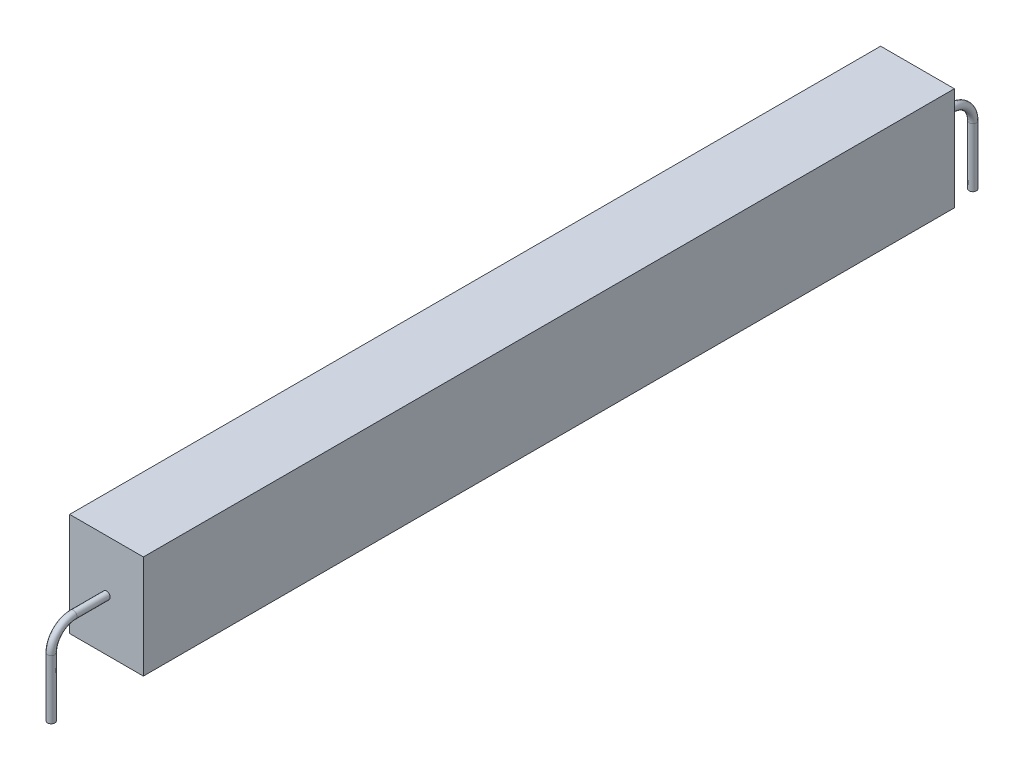
ISO-10303-21;
HEADER;
FILE_DESCRIPTION(('STEP AP214'),'2;1');
FILE_NAME('part.step','',(''),(''),'','','');
FILE_SCHEMA(('AUTOMOTIVE_DESIGN { 1 0 10303 214 1 1 1 1 }'));
ENDSEC;
DATA;
#1=APPLICATION_CONTEXT('core data for automotive mechanical design processes');
#2=APPLICATION_PROTOCOL_DEFINITION('international standard','automotive_design',2000,#1);
#3=PRODUCT_CONTEXT('',#1,'mechanical');
#4=PRODUCT('Part','Part','',(#3));
#5=PRODUCT_RELATED_PRODUCT_CATEGORY('part','',(#4));
#6=PRODUCT_DEFINITION_FORMATION('','',#4);
#7=PRODUCT_DEFINITION_CONTEXT('part definition',#1,'design');
#8=PRODUCT_DEFINITION('design','',#6,#7);
#9=PRODUCT_DEFINITION_SHAPE('','',#8);
#10=(LENGTH_UNIT() NAMED_UNIT(*) SI_UNIT(.MILLI.,.METRE.));
#11=(NAMED_UNIT(*) PLANE_ANGLE_UNIT() SI_UNIT($,.RADIAN.));
#12=(NAMED_UNIT(*) SI_UNIT($,.STERADIAN.) SOLID_ANGLE_UNIT());
#13=UNCERTAINTY_MEASURE_WITH_UNIT(LENGTH_MEASURE(1.E-05),#10,'distance_accuracy_value','');
#14=(GEOMETRIC_REPRESENTATION_CONTEXT(3) GLOBAL_UNCERTAINTY_ASSIGNED_CONTEXT((#13)) GLOBAL_UNIT_ASSIGNED_CONTEXT((#10,
#11,#12)) REPRESENTATION_CONTEXT('',''));
#15=CARTESIAN_POINT('',(0.,0.,0.));
#16=DIRECTION('',(0.,0.,1.));
#17=DIRECTION('',(1.,0.,0.));
#18=AXIS2_PLACEMENT_3D('',#15,#16,#17);
#19=CARTESIAN_POINT('',(4.99999999999999,14.,-55.));
#20=DIRECTION('',(1.,0.,0.));
#21=DIRECTION('',(0.,0.,-1.));
#22=AXIS2_PLACEMENT_3D('',#19,#20,#21);
#23=PLANE('',#22);
#24=DIRECTION('',(0.,1.,0.));
#25=VECTOR('',#24,1.);
#26=CARTESIAN_POINT('',(4.99999999999999,14.,55.));
#27=LINE('',#26,#25);
#28=CARTESIAN_POINT('',(4.99999999999999,0.,55.));
#29=VERTEX_POINT('',#28);
#30=CARTESIAN_POINT('',(4.99999999999999,14.,55.));
#31=VERTEX_POINT('',#30);
#32=EDGE_CURVE('E102',#29,#31,#27,.T.);
#33=ORIENTED_EDGE('',*,*,#32,.F.);
#34=DIRECTION('',(0.,0.,1.));
#35=VECTOR('',#34,1.);
#36=CARTESIAN_POINT('',(4.99999999999999,0.,-55.));
#37=LINE('',#36,#35);
#38=CARTESIAN_POINT('',(4.99999999999999,0.,-55.));
#39=VERTEX_POINT('',#38);
#40=EDGE_CURVE('E44',#39,#29,#37,.T.);
#41=ORIENTED_EDGE('',*,*,#40,.F.);
#42=DIRECTION('',(0.,1.,0.));
#43=VECTOR('',#42,1.);
#44=CARTESIAN_POINT('',(4.99999999999999,14.,-55.));
#45=LINE('',#44,#43);
#46=CARTESIAN_POINT('',(4.99999999999999,14.,-55.));
#47=VERTEX_POINT('',#46);
#48=EDGE_CURVE('E95',#39,#47,#45,.T.);
#49=ORIENTED_EDGE('',*,*,#48,.T.);
#50=DIRECTION('',(0.,0.,1.));
#51=VECTOR('',#50,1.);
#52=CARTESIAN_POINT('',(4.99999999999999,14.,-55.));
#53=LINE('',#52,#51);
#54=EDGE_CURVE('E38',#47,#31,#53,.T.);
#55=ORIENTED_EDGE('',*,*,#54,.T.);
#56=EDGE_LOOP('',(#33,#41,#49,#55));
#57=FACE_BOUND('',#56,.T.);
#58=ADVANCED_FACE('F35',(#57),#23,.T.);
#59=CARTESIAN_POINT('',(-5.,0.,-55.));
#60=DIRECTION('',(0.,-1.,0.));
#61=DIRECTION('',(0.,0.,-1.));
#62=AXIS2_PLACEMENT_3D('',#59,#60,#61);
#63=PLANE('',#62);
#64=DIRECTION('',(1.,0.,0.));
#65=VECTOR('',#64,1.);
#66=CARTESIAN_POINT('',(-5.,0.,55.));
#67=LINE('',#66,#65);
#68=CARTESIAN_POINT('',(-5.,0.,55.));
#69=VERTEX_POINT('',#68);
#70=EDGE_CURVE('E97',#69,#29,#67,.T.);
#71=ORIENTED_EDGE('',*,*,#70,.F.);
#72=DIRECTION('',(0.,0.,1.));
#73=VECTOR('',#72,1.);
#74=CARTESIAN_POINT('',(-5.,0.,-55.));
#75=LINE('',#74,#73);
#76=CARTESIAN_POINT('',(-5.,0.,-55.));
#77=VERTEX_POINT('',#76);
#78=EDGE_CURVE('E69',#77,#69,#75,.T.);
#79=ORIENTED_EDGE('',*,*,#78,.F.);
#80=DIRECTION('',(1.,0.,0.));
#81=VECTOR('',#80,1.);
#82=CARTESIAN_POINT('',(-5.,0.,-55.));
#83=LINE('',#82,#81);
#84=EDGE_CURVE('E92',#77,#39,#83,.T.);
#85=ORIENTED_EDGE('',*,*,#84,.T.);
#86=ORIENTED_EDGE('',*,*,#40,.T.);
#87=EDGE_LOOP('',(#71,#79,#85,#86));
#88=FACE_BOUND('',#87,.T.);
#89=ADVANCED_FACE('F114',(#88),#63,.T.);
#90=CARTESIAN_POINT('',(-5.,14.,-55.));
#91=DIRECTION('',(-1.,0.,0.));
#92=DIRECTION('',(0.,0.,1.));
#93=AXIS2_PLACEMENT_3D('',#90,#91,#92);
#94=PLANE('',#93);
#95=DIRECTION('',(0.,-1.,0.));
#96=VECTOR('',#95,1.);
#97=CARTESIAN_POINT('',(-5.,14.,55.));
#98=LINE('',#97,#96);
#99=CARTESIAN_POINT('',(-5.,14.,55.));
#100=VERTEX_POINT('',#99);
#101=EDGE_CURVE('E87',#100,#69,#98,.T.);
#102=ORIENTED_EDGE('',*,*,#101,.F.);
#103=DIRECTION('',(0.,0.,1.));
#104=VECTOR('',#103,1.);
#105=CARTESIAN_POINT('',(-5.,14.,-55.));
#106=LINE('',#105,#104);
#107=CARTESIAN_POINT('',(-5.,14.,-55.));
#108=VERTEX_POINT('',#107);
#109=EDGE_CURVE('E82',#108,#100,#106,.T.);
#110=ORIENTED_EDGE('',*,*,#109,.F.);
#111=DIRECTION('',(0.,-1.,0.));
#112=VECTOR('',#111,1.);
#113=CARTESIAN_POINT('',(-5.,14.,-55.));
#114=LINE('',#113,#112);
#115=EDGE_CURVE('E85',#108,#77,#114,.T.);
#116=ORIENTED_EDGE('',*,*,#115,.T.);
#117=ORIENTED_EDGE('',*,*,#78,.T.);
#118=EDGE_LOOP('',(#102,#110,#116,#117));
#119=FACE_BOUND('',#118,.T.);
#120=ADVANCED_FACE('F84',(#119),#94,.T.);
#121=CARTESIAN_POINT('',(-5.,14.,-55.));
#122=DIRECTION('',(0.,1.,0.));
#123=DIRECTION('',(0.,0.,1.));
#124=AXIS2_PLACEMENT_3D('',#121,#122,#123);
#125=PLANE('',#124);
#126=DIRECTION('',(-1.,0.,0.));
#127=VECTOR('',#126,1.);
#128=CARTESIAN_POINT('',(-5.,14.,55.));
#129=LINE('',#128,#127);
#130=EDGE_CURVE('E105',#31,#100,#129,.T.);
#131=ORIENTED_EDGE('',*,*,#130,.F.);
#132=ORIENTED_EDGE('',*,*,#54,.F.);
#133=DIRECTION('',(-1.,0.,0.));
#134=VECTOR('',#133,1.);
#135=CARTESIAN_POINT('',(-5.,14.,-55.));
#136=LINE('',#135,#134);
#137=EDGE_CURVE('E91',#47,#108,#136,.T.);
#138=ORIENTED_EDGE('',*,*,#137,.T.);
#139=ORIENTED_EDGE('',*,*,#109,.T.);
#140=EDGE_LOOP('',(#131,#132,#138,#139));
#141=FACE_BOUND('',#140,.T.);
#142=ADVANCED_FACE('F94',(#141),#125,.T.);
#143=CARTESIAN_POINT('',(0.,0.,-55.));
#144=DIRECTION('',(0.,0.,1.));
#145=DIRECTION('',(1.,0.,0.));
#146=AXIS2_PLACEMENT_3D('',#143,#144,#145);
#147=PLANE('',#146);
#148=CARTESIAN_POINT('',(0.,7.,-55.));
#149=DIRECTION('',(0.,0.,1.));
#150=DIRECTION('',(1.,0.,0.));
#151=AXIS2_PLACEMENT_3D('',#148,#149,#150);
#152=CIRCLE('',#151,0.5);
#153=CARTESIAN_POINT('',(0.5,7.,-55.));
#154=VERTEX_POINT('',#153);
#155=EDGE_CURVE('E189',#154,#154,#152,.T.);
#156=ORIENTED_EDGE('',*,*,#155,.T.);
#157=EDGE_LOOP('',(#156));
#158=FACE_BOUND('',#157,.T.);
#159=ORIENTED_EDGE('',*,*,#48,.F.);
#160=ORIENTED_EDGE('',*,*,#84,.F.);
#161=ORIENTED_EDGE('',*,*,#115,.F.);
#162=ORIENTED_EDGE('',*,*,#137,.F.);
#163=EDGE_LOOP('',(#159,#160,#161,#162));
#164=FACE_BOUND('',#163,.T.);
#165=ADVANCED_FACE('F90',(#158,#164),#147,.F.);
#166=CARTESIAN_POINT('',(0.,0.,55.));
#167=DIRECTION('',(0.,0.,1.));
#168=DIRECTION('',(1.,0.,0.));
#169=AXIS2_PLACEMENT_3D('',#166,#167,#168);
#170=PLANE('',#169);
#171=CARTESIAN_POINT('',(0.,7.,55.));
#172=DIRECTION('',(0.,0.,1.));
#173=DIRECTION('',(1.,0.,0.));
#174=AXIS2_PLACEMENT_3D('',#171,#172,#173);
#175=CIRCLE('',#174,0.5);
#176=CARTESIAN_POINT('',(0.5,7.,55.));
#177=VERTEX_POINT('',#176);
#178=EDGE_CURVE('E11',#177,#177,#175,.T.);
#179=ORIENTED_EDGE('',*,*,#178,.F.);
#180=EDGE_LOOP('',(#179));
#181=FACE_BOUND('',#180,.T.);
#182=ORIENTED_EDGE('',*,*,#32,.T.);
#183=ORIENTED_EDGE('',*,*,#130,.T.);
#184=ORIENTED_EDGE('',*,*,#101,.T.);
#185=ORIENTED_EDGE('',*,*,#70,.T.);
#186=EDGE_LOOP('',(#182,#183,#184,#185));
#187=FACE_BOUND('',#186,.T.);
#188=ADVANCED_FACE('F113',(#181,#187),#170,.T.);
#189=CARTESIAN_POINT('',(0.,4.,62.5));
#190=DIRECTION('',(0.,-1.,0.));
#191=DIRECTION('',(0.,0.,-1.));
#192=AXIS2_PLACEMENT_3D('',#189,#190,#191);
#193=CYLINDRICAL_SURFACE('',#192,0.5);
#194=CARTESIAN_POINT('',(0.,4.,62.5));
#195=DIRECTION('',(0.,-1.,0.));
#196=DIRECTION('',(1.,0.,0.));
#197=AXIS2_PLACEMENT_3D('',#194,#195,#196);
#198=CIRCLE('',#197,0.5);
#199=CARTESIAN_POINT('',(0.,4.,63.));
#200=VERTEX_POINT('',#199);
#201=EDGE_CURVE('E176',#200,#200,#198,.T.);
#202=ORIENTED_EDGE('',*,*,#201,.T.);
#203=EDGE_LOOP('',(#202));
#204=FACE_BOUND('',#203,.T.);
#205=CARTESIAN_POINT('',(0.,-4.,62.5));
#206=DIRECTION('',(0.,-1.,0.));
#207=DIRECTION('',(1.,0.,0.));
#208=AXIS2_PLACEMENT_3D('',#205,#206,#207);
#209=CIRCLE('',#208,0.5);
#210=CARTESIAN_POINT('',(0.5,-4.,62.5));
#211=VERTEX_POINT('',#210);
#212=EDGE_CURVE('E106',#211,#211,#209,.T.);
#213=ORIENTED_EDGE('',*,*,#212,.F.);
#214=EDGE_LOOP('',(#213));
#215=FACE_BOUND('',#214,.T.);
#216=ADVANCED_FACE('F132',(#204,#215),#193,.T.);
#217=CARTESIAN_POINT('',(0.,4.,59.5));
#218=DIRECTION('',(1.,0.,0.));
#219=DIRECTION('',(0.,0.,-1.));
#220=AXIS2_PLACEMENT_3D('',#217,#218,#219);
#221=TOROIDAL_SURFACE('',#220,3.00000000000001,0.5);
#222=CARTESIAN_POINT('',(0.,7.00000000000001,59.5));
#223=DIRECTION('',(0.,0.,1.));
#224=DIRECTION('',(1.,0.,0.));
#225=AXIS2_PLACEMENT_3D('',#222,#223,#224);
#226=CIRCLE('',#225,0.5);
#227=CARTESIAN_POINT('',(0.,7.50000000000001,59.5));
#228=VERTEX_POINT('',#227);
#229=EDGE_CURVE('E172',#228,#228,#226,.T.);
#230=CARTESIAN_POINT('',(0.,4.,59.5));
#231=DIRECTION('',(1.,0.,0.));
#232=DIRECTION('',(0.,0.,-1.));
#233=AXIS2_PLACEMENT_3D('',#230,#231,#232);
#234=CIRCLE('',#233,3.50000000000001);
#235=EDGE_CURVE('',#228,#200,#234,.T.);
#236=ORIENTED_EDGE('',*,*,#229,.T.);
#237=ORIENTED_EDGE('',*,*,#201,.F.);
#238=ORIENTED_EDGE('',*,*,#235,.T.);
#239=ORIENTED_EDGE('',*,*,#235,.F.);
#240=EDGE_LOOP('',(#236,#238,#237,#239));
#241=FACE_BOUND('',#240,.T.);
#242=ADVANCED_FACE('F138',(#241),#221,.T.);
#243=CARTESIAN_POINT('',(0.,7.00000000000001,59.5));
#244=DIRECTION('',(0.,0.,-1.));
#245=DIRECTION('',(0.,1.,0.));
#246=AXIS2_PLACEMENT_3D('',#243,#244,#245);
#247=CYLINDRICAL_SURFACE('',#246,0.5);
#248=ORIENTED_EDGE('',*,*,#229,.F.);
#249=EDGE_LOOP('',(#248));
#250=FACE_BOUND('',#249,.T.);
#251=ORIENTED_EDGE('',*,*,#178,.T.);
#252=EDGE_LOOP('',(#251));
#253=FACE_BOUND('',#252,.T.);
#254=ADVANCED_FACE('F142',(#250,#253),#247,.T.);
#255=CARTESIAN_POINT('',(0.,-4.,62.5));
#256=DIRECTION('',(0.,-1.,0.));
#257=DIRECTION('',(1.,0.,0.));
#258=AXIS2_PLACEMENT_3D('',#255,#256,#257);
#259=PLANE('',#258);
#260=ORIENTED_EDGE('',*,*,#212,.T.);
#261=EDGE_LOOP('',(#260));
#262=FACE_BOUND('',#261,.T.);
#263=ADVANCED_FACE('F146',(#262),#259,.T.);
#264=CARTESIAN_POINT('',(0.,4.,-62.5));
#265=DIRECTION('',(0.,-1.,0.));
#266=DIRECTION('',(0.,0.,-1.));
#267=AXIS2_PLACEMENT_3D('',#264,#265,#266);
#268=CYLINDRICAL_SURFACE('',#267,0.5);
#269=CARTESIAN_POINT('',(0.,4.,-62.5));
#270=DIRECTION('',(0.,1.,0.));
#271=DIRECTION('',(1.,0.,0.));
#272=AXIS2_PLACEMENT_3D('',#269,#270,#271);
#273=CIRCLE('',#272,0.5);
#274=CARTESIAN_POINT('',(0.,4.,-63.));
#275=VERTEX_POINT('',#274);
#276=EDGE_CURVE('E173',#275,#275,#273,.T.);
#277=ORIENTED_EDGE('',*,*,#276,.F.);
#278=EDGE_LOOP('',(#277));
#279=FACE_BOUND('',#278,.T.);
#280=CARTESIAN_POINT('',(0.,-4.,-62.5));
#281=DIRECTION('',(0.,1.,0.));
#282=DIRECTION('',(1.,0.,0.));
#283=AXIS2_PLACEMENT_3D('',#280,#281,#282);
#284=CIRCLE('',#283,0.5);
#285=CARTESIAN_POINT('',(0.5,-4.,-62.5));
#286=VERTEX_POINT('',#285);
#287=EDGE_CURVE('E170',#286,#286,#284,.T.);
#288=ORIENTED_EDGE('',*,*,#287,.T.);
#289=EDGE_LOOP('',(#288));
#290=FACE_BOUND('',#289,.T.);
#291=ADVANCED_FACE('F150',(#279,#290),#268,.T.);
#292=CARTESIAN_POINT('',(0.,4.,-59.5));
#293=DIRECTION('',(-1.,0.,0.));
#294=DIRECTION('',(0.,0.,1.));
#295=AXIS2_PLACEMENT_3D('',#292,#293,#294);
#296=TOROIDAL_SURFACE('',#295,3.00000000000001,0.5);
#297=CARTESIAN_POINT('',(0.,7.00000000000001,-59.5));
#298=DIRECTION('',(0.,0.,1.));
#299=DIRECTION('',(1.,0.,0.));
#300=AXIS2_PLACEMENT_3D('',#297,#298,#299);
#301=CIRCLE('',#300,0.5);
#302=CARTESIAN_POINT('',(0.,7.50000000000001,-59.5));
#303=VERTEX_POINT('',#302);
#304=EDGE_CURVE('E179',#303,#303,#301,.T.);
#305=CARTESIAN_POINT('',(0.,4.,-59.5));
#306=DIRECTION('',(-1.,0.,0.));
#307=DIRECTION('',(0.,0.,1.));
#308=AXIS2_PLACEMENT_3D('',#305,#306,#307);
#309=CIRCLE('',#308,3.50000000000001);
#310=EDGE_CURVE('',#303,#275,#309,.T.);
#311=ORIENTED_EDGE('',*,*,#304,.F.);
#312=ORIENTED_EDGE('',*,*,#276,.T.);
#313=ORIENTED_EDGE('',*,*,#310,.T.);
#314=ORIENTED_EDGE('',*,*,#310,.F.);
#315=EDGE_LOOP('',(#311,#313,#312,#314));
#316=FACE_BOUND('',#315,.T.);
#317=ADVANCED_FACE('F154',(#316),#296,.T.);
#318=CARTESIAN_POINT('',(0.,7.00000000000001,-59.5));
#319=DIRECTION('',(0.,0.,1.));
#320=DIRECTION('',(0.,-1.,0.));
#321=AXIS2_PLACEMENT_3D('',#318,#319,#320);
#322=CYLINDRICAL_SURFACE('',#321,0.5);
#323=ORIENTED_EDGE('',*,*,#304,.T.);
#324=EDGE_LOOP('',(#323));
#325=FACE_BOUND('',#324,.T.);
#326=ORIENTED_EDGE('',*,*,#155,.F.);
#327=EDGE_LOOP('',(#326));
#328=FACE_BOUND('',#327,.T.);
#329=ADVANCED_FACE('F158',(#325,#328),#322,.T.);
#330=CARTESIAN_POINT('',(0.,-4.,-62.5));
#331=DIRECTION('',(0.,-1.,0.));
#332=DIRECTION('',(1.,0.,0.));
#333=AXIS2_PLACEMENT_3D('',#330,#331,#332);
#334=PLANE('',#333);
#335=ORIENTED_EDGE('',*,*,#287,.F.);
#336=EDGE_LOOP('',(#335));
#337=FACE_BOUND('',#336,.T.);
#338=ADVANCED_FACE('F162',(#337),#334,.T.);
#339=CLOSED_SHELL('',(#58,#89,#120,#142,#165,#188,#216,#242,#254,#263,#291,#317,#329,#338));
#340=MANIFOLD_SOLID_BREP('B2',#339);
#341=ADVANCED_BREP_SHAPE_REPRESENTATION('',(#18,#340),#14);
#342=SHAPE_DEFINITION_REPRESENTATION(#9,#341);
ENDSEC;
END-ISO-10303-21;
